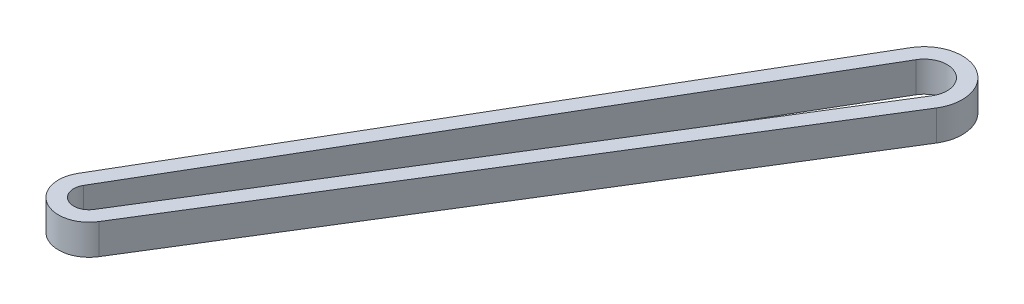
ISO-10303-21;
HEADER;
FILE_DESCRIPTION(('STEP AP214'),'2;1');
FILE_NAME('part.step','',(''),(''),'','','');
FILE_SCHEMA(('AUTOMOTIVE_DESIGN { 1 0 10303 214 1 1 1 1 }'));
ENDSEC;
DATA;
#1=APPLICATION_CONTEXT('core data for automotive mechanical design processes');
#2=APPLICATION_PROTOCOL_DEFINITION('international standard','automotive_design',2000,#1);
#3=PRODUCT_CONTEXT('',#1,'mechanical');
#4=PRODUCT('Part','Part','',(#3));
#5=PRODUCT_RELATED_PRODUCT_CATEGORY('part','',(#4));
#6=PRODUCT_DEFINITION_FORMATION('','',#4);
#7=PRODUCT_DEFINITION_CONTEXT('part definition',#1,'design');
#8=PRODUCT_DEFINITION('design','',#6,#7);
#9=PRODUCT_DEFINITION_SHAPE('','',#8);
#10=(LENGTH_UNIT() NAMED_UNIT(*) SI_UNIT(.MILLI.,.METRE.));
#11=(NAMED_UNIT(*) PLANE_ANGLE_UNIT() SI_UNIT($,.RADIAN.));
#12=(NAMED_UNIT(*) SI_UNIT($,.STERADIAN.) SOLID_ANGLE_UNIT());
#13=UNCERTAINTY_MEASURE_WITH_UNIT(LENGTH_MEASURE(1.E-05),#10,'distance_accuracy_value','');
#14=(GEOMETRIC_REPRESENTATION_CONTEXT(3) GLOBAL_UNCERTAINTY_ASSIGNED_CONTEXT((#13)) GLOBAL_UNIT_ASSIGNED_CONTEXT((#10,
#11,#12)) REPRESENTATION_CONTEXT('',''));
#15=CARTESIAN_POINT('',(0.,0.,0.));
#16=DIRECTION('',(0.,0.,1.));
#17=DIRECTION('',(1.,0.,0.));
#18=AXIS2_PLACEMENT_3D('',#15,#16,#17);
#19=CARTESIAN_POINT('',(-52.8448413805157,10.,86.9119655560122));
#20=DIRECTION('',(0.,1.,0.));
#21=DIRECTION('',(0.,0.,1.));
#22=AXIS2_PLACEMENT_3D('',#19,#20,#21);
#23=PLANE('',#22);
#24=CARTESIAN_POINT('',(-52.8448413805157,10.,86.9119655560122));
#25=DIRECTION('',(0.,1.,0.));
#26=DIRECTION('',(0.,0.,1.));
#27=AXIS2_PLACEMENT_3D('',#24,#25,#26);
#28=CIRCLE('',#27,10.);
#29=CARTESIAN_POINT('',(-61.4748622275927,10.,81.8599619753507));
#30=VERTEX_POINT('',#29);
#31=CARTESIAN_POINT('',(-44.34380763689,10.,92.1781240505638));
#32=VERTEX_POINT('',#31);
#33=EDGE_CURVE('E137',#30,#32,#28,.T.);
#34=ORIENTED_EDGE('',*,*,#33,.T.);
#35=DIRECTION('',(0.526615849455157,0.,-0.850103374362567));
#36=VECTOR('',#35,1.);
#37=CARTESIAN_POINT('',(-44.34380763689,10.,92.1781240505638));
#38=LINE('',#37,#36);
#39=CARTESIAN_POINT('',(60.9711335600478,10.,-77.8292674378227));
#40=VERTEX_POINT('',#39);
#41=EDGE_CURVE('E140',#32,#40,#38,.T.);
#42=ORIENTED_EDGE('',*,*,#41,.T.);
#43=CARTESIAN_POINT('',(50.3448413805157,10.,-84.4119655560122));
#44=DIRECTION('',(0.,1.,0.));
#45=DIRECTION('',(0.,0.,1.));
#46=AXIS2_PLACEMENT_3D('',#43,#44,#45);
#47=CIRCLE('',#46,12.5);
#48=CARTESIAN_POINT('',(39.5573153216694,10.,-90.7269700318391));
#49=VERTEX_POINT('',#48);
#50=EDGE_CURVE('E143',#40,#49,#47,.T.);
#51=ORIENTED_EDGE('',*,*,#50,.T.);
#52=DIRECTION('',(-0.505200358066154,0.,0.863002084707696));
#53=VECTOR('',#52,1.);
#54=CARTESIAN_POINT('',(-61.4748622275927,10.,81.8599619753507));
#55=LINE('',#54,#53);
#56=EDGE_CURVE('E145',#49,#30,#55,.T.);
#57=ORIENTED_EDGE('',*,*,#56,.T.);
#58=EDGE_LOOP('',(#34,#42,#51,#57));
#59=FACE_BOUND('',#58,.T.);
#60=DIRECTION('',(0.526615849455157,0.,-0.850103374362567));
#61=VECTOR('',#60,1.);
#62=CARTESIAN_POINT('',(-48.5943245087029,10.,89.545044803288));
#63=LINE('',#62,#61);
#64=CARTESIAN_POINT('',(-48.5943245087029,10.,89.545044803288));
#65=VERTEX_POINT('',#64);
#66=CARTESIAN_POINT('',(56.7206166882349,10.,-80.4623466850984));
#67=VERTEX_POINT('',#66);
#68=EDGE_CURVE('E109',#65,#67,#63,.T.);
#69=ORIENTED_EDGE('',*,*,#68,.F.);
#70=CARTESIAN_POINT('',(-52.8448413805157,10.,86.9119655560122));
#71=DIRECTION('',(0.,1.,0.));
#72=DIRECTION('',(0.,0.,1.));
#73=AXIS2_PLACEMENT_3D('',#70,#71,#72);
#74=CIRCLE('',#73,5.00000000000001);
#75=CARTESIAN_POINT('',(-57.1598518040542,10.,84.3859637656814));
#76=VERTEX_POINT('',#75);
#77=EDGE_CURVE('E101',#76,#65,#74,.T.);
#78=ORIENTED_EDGE('',*,*,#77,.F.);
#79=DIRECTION('',(-0.505200358066154,0.,0.863002084707696));
#80=VECTOR('',#79,1.);
#81=CARTESIAN_POINT('',(-57.1598518040542,10.,84.3859637656814));
#82=LINE('',#81,#80);
#83=CARTESIAN_POINT('',(43.8723257452079,10.,-88.2009682415083));
#84=VERTEX_POINT('',#83);
#85=EDGE_CURVE('E123',#84,#76,#82,.T.);
#86=ORIENTED_EDGE('',*,*,#85,.F.);
#87=CARTESIAN_POINT('',(50.3448413805157,10.,-84.4119655560122));
#88=DIRECTION('',(0.,1.,0.));
#89=DIRECTION('',(0.,0.,1.));
#90=AXIS2_PLACEMENT_3D('',#87,#88,#89);
#91=CIRCLE('',#90,7.50000000000003);
#92=EDGE_CURVE('E121',#67,#84,#91,.T.);
#93=ORIENTED_EDGE('',*,*,#92,.F.);
#94=EDGE_LOOP('',(#69,#78,#86,#93));
#95=FACE_BOUND('',#94,.T.);
#96=ADVANCED_FACE('F36',(#59,#95),#23,.T.);
#97=CARTESIAN_POINT('',(-52.8448413805157,0.,86.9119655560122));
#98=DIRECTION('',(0.,1.,0.));
#99=DIRECTION('',(0.,0.,1.));
#100=AXIS2_PLACEMENT_3D('',#97,#98,#99);
#101=PLANE('',#100);
#102=CARTESIAN_POINT('',(-52.8448413805157,0.,86.9119655560122));
#103=DIRECTION('',(0.,1.,0.));
#104=DIRECTION('',(0.,0.,1.));
#105=AXIS2_PLACEMENT_3D('',#102,#103,#104);
#106=CIRCLE('',#105,10.);
#107=CARTESIAN_POINT('',(-61.4748622275927,0.,81.8599619753507));
#108=VERTEX_POINT('',#107);
#109=CARTESIAN_POINT('',(-44.34380763689,0.,92.1781240505638));
#110=VERTEX_POINT('',#109);
#111=EDGE_CURVE('E117',#108,#110,#106,.T.);
#112=ORIENTED_EDGE('',*,*,#111,.F.);
#113=DIRECTION('',(-0.505200358066154,0.,0.863002084707696));
#114=VECTOR('',#113,1.);
#115=CARTESIAN_POINT('',(-61.4748622275927,0.,81.8599619753507));
#116=LINE('',#115,#114);
#117=CARTESIAN_POINT('',(39.5573153216694,0.,-90.7269700318391));
#118=VERTEX_POINT('',#117);
#119=EDGE_CURVE('E141',#118,#108,#116,.T.);
#120=ORIENTED_EDGE('',*,*,#119,.F.);
#121=CARTESIAN_POINT('',(50.3448413805157,0.,-84.4119655560122));
#122=DIRECTION('',(0.,1.,0.));
#123=DIRECTION('',(0.,0.,1.));
#124=AXIS2_PLACEMENT_3D('',#121,#122,#123);
#125=CIRCLE('',#124,12.5);
#126=CARTESIAN_POINT('',(60.9711335600478,0.,-77.8292674378227));
#127=VERTEX_POINT('',#126);
#128=EDGE_CURVE('E152',#127,#118,#125,.T.);
#129=ORIENTED_EDGE('',*,*,#128,.F.);
#130=DIRECTION('',(0.526615849455157,0.,-0.850103374362567));
#131=VECTOR('',#130,1.);
#132=CARTESIAN_POINT('',(-44.34380763689,0.,92.1781240505638));
#133=LINE('',#132,#131);
#134=EDGE_CURVE('E150',#110,#127,#133,.T.);
#135=ORIENTED_EDGE('',*,*,#134,.F.);
#136=EDGE_LOOP('',(#112,#120,#129,#135));
#137=FACE_BOUND('',#136,.T.);
#138=CARTESIAN_POINT('',(-52.8448413805157,0.,86.9119655560122));
#139=DIRECTION('',(0.,1.,0.));
#140=DIRECTION('',(0.,0.,1.));
#141=AXIS2_PLACEMENT_3D('',#138,#139,#140);
#142=CIRCLE('',#141,5.00000000000001);
#143=CARTESIAN_POINT('',(-57.1598518040542,0.,84.3859637656814));
#144=VERTEX_POINT('',#143);
#145=CARTESIAN_POINT('',(-48.5943245087029,0.,89.545044803288));
#146=VERTEX_POINT('',#145);
#147=EDGE_CURVE('E59',#144,#146,#142,.T.);
#148=ORIENTED_EDGE('',*,*,#147,.T.);
#149=DIRECTION('',(0.526615849455157,0.,-0.850103374362567));
#150=VECTOR('',#149,1.);
#151=CARTESIAN_POINT('',(-48.5943245087029,0.,89.545044803288));
#152=LINE('',#151,#150);
#153=CARTESIAN_POINT('',(56.7206166882349,0.,-80.4623466850984));
#154=VERTEX_POINT('',#153);
#155=EDGE_CURVE('E116',#146,#154,#152,.T.);
#156=ORIENTED_EDGE('',*,*,#155,.T.);
#157=CARTESIAN_POINT('',(50.3448413805157,0.,-84.4119655560122));
#158=DIRECTION('',(0.,1.,0.));
#159=DIRECTION('',(0.,0.,1.));
#160=AXIS2_PLACEMENT_3D('',#157,#158,#159);
#161=CIRCLE('',#160,7.50000000000003);
#162=CARTESIAN_POINT('',(43.8723257452079,0.,-88.2009682415083));
#163=VERTEX_POINT('',#162);
#164=EDGE_CURVE('E129',#154,#163,#161,.T.);
#165=ORIENTED_EDGE('',*,*,#164,.T.);
#166=DIRECTION('',(-0.505200358066154,0.,0.863002084707696));
#167=VECTOR('',#166,1.);
#168=CARTESIAN_POINT('',(-57.1598518040542,0.,84.3859637656814));
#169=LINE('',#168,#167);
#170=EDGE_CURVE('E110',#163,#144,#169,.T.);
#171=ORIENTED_EDGE('',*,*,#170,.T.);
#172=EDGE_LOOP('',(#148,#156,#165,#171));
#173=FACE_BOUND('',#172,.T.);
#174=ADVANCED_FACE('F170',(#137,#173),#101,.F.);
#175=CARTESIAN_POINT('',(-52.8448413805157,10.,86.9119655560122));
#176=DIRECTION('',(0.,-1.,0.));
#177=DIRECTION('',(0.,0.,-1.));
#178=AXIS2_PLACEMENT_3D('',#175,#176,#177);
#179=CYLINDRICAL_SURFACE('',#178,10.);
#180=ORIENTED_EDGE('',*,*,#111,.T.);
#181=DIRECTION('',(0.,-1.,0.));
#182=VECTOR('',#181,1.);
#183=CARTESIAN_POINT('',(-44.34380763689,10.,92.1781240505638));
#184=LINE('',#183,#182);
#185=EDGE_CURVE('E11',#32,#110,#184,.T.);
#186=ORIENTED_EDGE('',*,*,#185,.F.);
#187=ORIENTED_EDGE('',*,*,#33,.F.);
#188=DIRECTION('',(0.,-1.,0.));
#189=VECTOR('',#188,1.);
#190=CARTESIAN_POINT('',(-61.4748622275927,10.,81.8599619753507));
#191=LINE('',#190,#189);
#192=EDGE_CURVE('E147',#30,#108,#191,.T.);
#193=ORIENTED_EDGE('',*,*,#192,.T.);
#194=EDGE_LOOP('',(#180,#186,#187,#193));
#195=FACE_BOUND('',#194,.T.);
#196=ADVANCED_FACE('F38',(#195),#179,.T.);
#197=CARTESIAN_POINT('',(-44.34380763689,10.,92.1781240505638));
#198=DIRECTION('',(-0.850103374362567,0.,-0.526615849455157));
#199=DIRECTION('',(-0.526615849455157,0.,0.850103374362567));
#200=AXIS2_PLACEMENT_3D('',#197,#198,#199);
#201=PLANE('',#200);
#202=ORIENTED_EDGE('',*,*,#134,.T.);
#203=DIRECTION('',(0.,-1.,0.));
#204=VECTOR('',#203,1.);
#205=CARTESIAN_POINT('',(60.9711335600478,10.,-77.8292674378227));
#206=LINE('',#205,#204);
#207=EDGE_CURVE('E44',#40,#127,#206,.T.);
#208=ORIENTED_EDGE('',*,*,#207,.F.);
#209=ORIENTED_EDGE('',*,*,#41,.F.);
#210=ORIENTED_EDGE('',*,*,#185,.T.);
#211=EDGE_LOOP('',(#202,#208,#209,#210));
#212=FACE_BOUND('',#211,.T.);
#213=ADVANCED_FACE('F180',(#212),#201,.F.);
#214=CARTESIAN_POINT('',(50.3448413805157,10.,-84.4119655560122));
#215=DIRECTION('',(0.,-1.,0.));
#216=DIRECTION('',(0.,0.,-1.));
#217=AXIS2_PLACEMENT_3D('',#214,#215,#216);
#218=CYLINDRICAL_SURFACE('',#217,12.5);
#219=ORIENTED_EDGE('',*,*,#128,.T.);
#220=DIRECTION('',(0.,-1.,0.));
#221=VECTOR('',#220,1.);
#222=CARTESIAN_POINT('',(39.5573153216694,10.,-90.7269700318391));
#223=LINE('',#222,#221);
#224=EDGE_CURVE('E157',#49,#118,#223,.T.);
#225=ORIENTED_EDGE('',*,*,#224,.F.);
#226=ORIENTED_EDGE('',*,*,#50,.F.);
#227=ORIENTED_EDGE('',*,*,#207,.T.);
#228=EDGE_LOOP('',(#219,#225,#226,#227));
#229=FACE_BOUND('',#228,.T.);
#230=ADVANCED_FACE('F164',(#229),#218,.T.);
#231=CARTESIAN_POINT('',(-61.4748622275927,10.,81.8599619753507));
#232=DIRECTION('',(0.863002084707696,0.,0.505200358066154));
#233=DIRECTION('',(0.505200358066154,0.,-0.863002084707696));
#234=AXIS2_PLACEMENT_3D('',#231,#232,#233);
#235=PLANE('',#234);
#236=ORIENTED_EDGE('',*,*,#119,.T.);
#237=ORIENTED_EDGE('',*,*,#192,.F.);
#238=ORIENTED_EDGE('',*,*,#56,.F.);
#239=ORIENTED_EDGE('',*,*,#224,.T.);
#240=EDGE_LOOP('',(#236,#237,#238,#239));
#241=FACE_BOUND('',#240,.T.);
#242=ADVANCED_FACE('F174',(#241),#235,.F.);
#243=CARTESIAN_POINT('',(-52.8448413805157,10.,86.9119655560122));
#244=DIRECTION('',(0.,-1.,0.));
#245=DIRECTION('',(0.,0.,-1.));
#246=AXIS2_PLACEMENT_3D('',#243,#244,#245);
#247=CYLINDRICAL_SURFACE('',#246,5.00000000000001);
#248=ORIENTED_EDGE('',*,*,#147,.F.);
#249=DIRECTION('',(0.,-1.,0.));
#250=VECTOR('',#249,1.);
#251=CARTESIAN_POINT('',(-57.1598518040542,10.,84.3859637656814));
#252=LINE('',#251,#250);
#253=EDGE_CURVE('E105',#76,#144,#252,.T.);
#254=ORIENTED_EDGE('',*,*,#253,.F.);
#255=ORIENTED_EDGE('',*,*,#77,.T.);
#256=DIRECTION('',(0.,-1.,0.));
#257=VECTOR('',#256,1.);
#258=CARTESIAN_POINT('',(-48.5943245087029,10.,89.545044803288));
#259=LINE('',#258,#257);
#260=EDGE_CURVE('E104',#65,#146,#259,.T.);
#261=ORIENTED_EDGE('',*,*,#260,.T.);
#262=EDGE_LOOP('',(#248,#254,#255,#261));
#263=FACE_BOUND('',#262,.T.);
#264=ADVANCED_FACE('F103',(#263),#247,.F.);
#265=CARTESIAN_POINT('',(-48.5943245087029,10.,89.545044803288));
#266=DIRECTION('',(-0.850103374362567,0.,-0.526615849455157));
#267=DIRECTION('',(-0.526615849455157,0.,0.850103374362567));
#268=AXIS2_PLACEMENT_3D('',#265,#266,#267);
#269=PLANE('',#268);
#270=ORIENTED_EDGE('',*,*,#155,.F.);
#271=ORIENTED_EDGE('',*,*,#260,.F.);
#272=ORIENTED_EDGE('',*,*,#68,.T.);
#273=DIRECTION('',(0.,-1.,0.));
#274=VECTOR('',#273,1.);
#275=CARTESIAN_POINT('',(56.7206166882349,10.,-80.4623466850984));
#276=LINE('',#275,#274);
#277=EDGE_CURVE('E118',#67,#154,#276,.T.);
#278=ORIENTED_EDGE('',*,*,#277,.T.);
#279=EDGE_LOOP('',(#270,#271,#272,#278));
#280=FACE_BOUND('',#279,.T.);
#281=ADVANCED_FACE('F113',(#280),#269,.T.);
#282=CARTESIAN_POINT('',(50.3448413805157,10.,-84.4119655560122));
#283=DIRECTION('',(0.,-1.,0.));
#284=DIRECTION('',(0.,0.,-1.));
#285=AXIS2_PLACEMENT_3D('',#282,#283,#284);
#286=CYLINDRICAL_SURFACE('',#285,7.50000000000003);
#287=ORIENTED_EDGE('',*,*,#164,.F.);
#288=ORIENTED_EDGE('',*,*,#277,.F.);
#289=ORIENTED_EDGE('',*,*,#92,.T.);
#290=DIRECTION('',(0.,-1.,0.));
#291=VECTOR('',#290,1.);
#292=CARTESIAN_POINT('',(43.8723257452079,10.,-88.2009682415083));
#293=LINE('',#292,#291);
#294=EDGE_CURVE('E51',#84,#163,#293,.T.);
#295=ORIENTED_EDGE('',*,*,#294,.T.);
#296=EDGE_LOOP('',(#287,#288,#289,#295));
#297=FACE_BOUND('',#296,.T.);
#298=ADVANCED_FACE('F203',(#297),#286,.F.);
#299=CARTESIAN_POINT('',(-57.1598518040542,10.,84.3859637656814));
#300=DIRECTION('',(0.863002084707696,0.,0.505200358066154));
#301=DIRECTION('',(0.505200358066154,0.,-0.863002084707696));
#302=AXIS2_PLACEMENT_3D('',#299,#300,#301);
#303=PLANE('',#302);
#304=ORIENTED_EDGE('',*,*,#170,.F.);
#305=ORIENTED_EDGE('',*,*,#294,.F.);
#306=ORIENTED_EDGE('',*,*,#85,.T.);
#307=ORIENTED_EDGE('',*,*,#253,.T.);
#308=EDGE_LOOP('',(#304,#305,#306,#307));
#309=FACE_BOUND('',#308,.T.);
#310=ADVANCED_FACE('F207',(#309),#303,.T.);
#311=CLOSED_SHELL('',(#96,#174,#196,#213,#230,#242,#264,#281,#298,#310));
#312=MANIFOLD_SOLID_BREP('B2',#311);
#313=ADVANCED_BREP_SHAPE_REPRESENTATION('',(#18,#312),#14);
#314=SHAPE_DEFINITION_REPRESENTATION(#9,#313);
ENDSEC;
END-ISO-10303-21;
